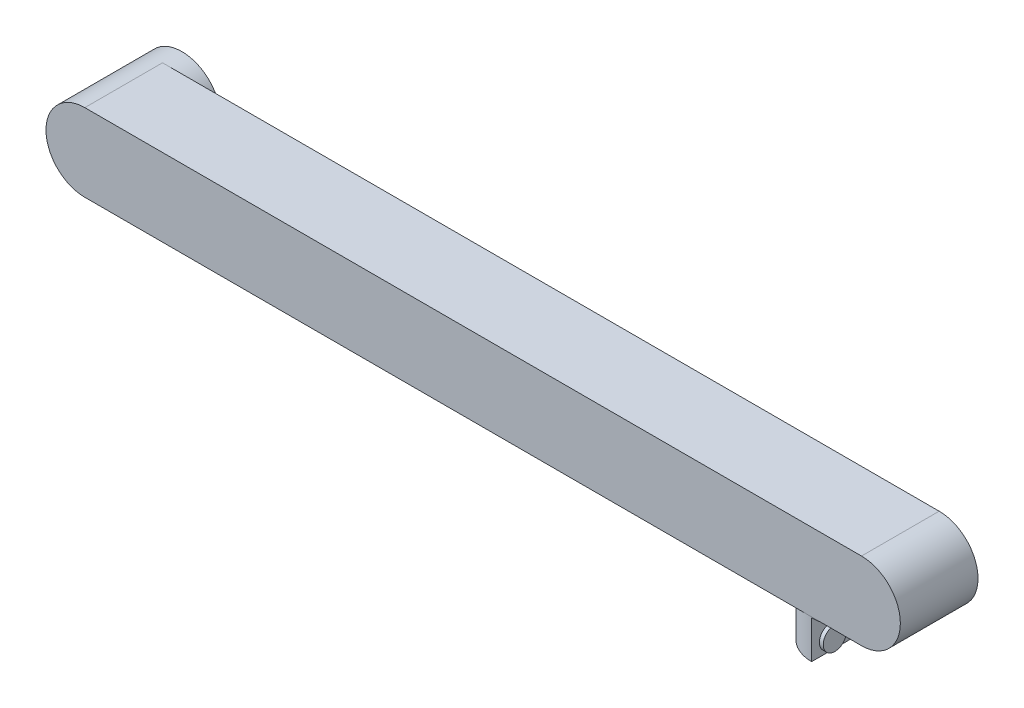
ISO-10303-21;
HEADER;
FILE_DESCRIPTION(('STEP AP214'),'2;1');
FILE_NAME('part.step','',(''),(''),'','','');
FILE_SCHEMA(('AUTOMOTIVE_DESIGN { 1 0 10303 214 1 1 1 1 }'));
ENDSEC;
DATA;
#1=APPLICATION_CONTEXT('core data for automotive mechanical design processes');
#2=APPLICATION_PROTOCOL_DEFINITION('international standard','automotive_design',2000,#1);
#3=PRODUCT_CONTEXT('',#1,'mechanical');
#4=PRODUCT('Part','Part','',(#3));
#5=PRODUCT_RELATED_PRODUCT_CATEGORY('part','',(#4));
#6=PRODUCT_DEFINITION_FORMATION('','',#4);
#7=PRODUCT_DEFINITION_CONTEXT('part definition',#1,'design');
#8=PRODUCT_DEFINITION('design','',#6,#7);
#9=PRODUCT_DEFINITION_SHAPE('','',#8);
#10=(LENGTH_UNIT() NAMED_UNIT(*) SI_UNIT(.MILLI.,.METRE.));
#11=(NAMED_UNIT(*) PLANE_ANGLE_UNIT() SI_UNIT($,.RADIAN.));
#12=(NAMED_UNIT(*) SI_UNIT($,.STERADIAN.) SOLID_ANGLE_UNIT());
#13=UNCERTAINTY_MEASURE_WITH_UNIT(LENGTH_MEASURE(1.E-05),#10,'distance_accuracy_value','');
#14=(GEOMETRIC_REPRESENTATION_CONTEXT(3) GLOBAL_UNCERTAINTY_ASSIGNED_CONTEXT((#13)) GLOBAL_UNIT_ASSIGNED_CONTEXT((#10,
#11,#12)) REPRESENTATION_CONTEXT('',''));
#15=CARTESIAN_POINT('',(0.,0.,0.));
#16=DIRECTION('',(0.,0.,1.));
#17=DIRECTION('',(1.,0.,0.));
#18=AXIS2_PLACEMENT_3D('',#15,#16,#17);
#19=CARTESIAN_POINT('',(117.087248421469,-10.7921939320018,10.));
#20=DIRECTION('',(0.,1.,0.));
#21=DIRECTION('',(0.,0.,1.));
#22=AXIS2_PLACEMENT_3D('',#19,#20,#21);
#23=CYLINDRICAL_SURFACE('',#22,10.);
#24=CARTESIAN_POINT('',(117.087248421469,-0.792193932001847,10.));
#25=DIRECTION('',(0.,-1.,0.));
#26=DIRECTION('',(0.,0.,-1.));
#27=AXIS2_PLACEMENT_3D('',#24,#25,#26);
#28=CIRCLE('',#27,10.);
#29=CARTESIAN_POINT('',(117.087248421469,-0.792193932001847,0.));
#30=VERTEX_POINT('',#29);
#31=CARTESIAN_POINT('',(117.087248421469,-0.792193932001847,20.));
#32=VERTEX_POINT('',#31);
#33=EDGE_CURVE('E67',#30,#32,#28,.T.);
#34=ORIENTED_EDGE('',*,*,#33,.T.);
#35=EDGE_CURVE('E153',#32,#30,#28,.T.);
#36=ORIENTED_EDGE('',*,*,#35,.T.);
#37=EDGE_LOOP('',(#34,#36));
#38=FACE_BOUND('',#37,.T.);
#39=DIRECTION('',(0.,1.,0.));
#40=VECTOR('',#39,1.);
#41=CARTESIAN_POINT('',(117.,-10.7921939320018,0.000380621596074437));
#42=LINE('',#41,#40);
#43=CARTESIAN_POINT('',(117.,-10.7921939320018,0.000380621596074437));
#44=VERTEX_POINT('',#43);
#45=CARTESIAN_POINT('',(117.,-0.990499508233855,0.000380621596074437));
#46=VERTEX_POINT('',#45);
#47=EDGE_CURVE('E150',#44,#46,#42,.T.);
#48=ORIENTED_EDGE('',*,*,#47,.F.);
#49=CARTESIAN_POINT('',(117.087248421469,-10.7921939320018,10.));
#50=DIRECTION('',(0.,-1.,0.));
#51=DIRECTION('',(0.,0.,-1.));
#52=AXIS2_PLACEMENT_3D('',#49,#50,#51);
#53=CIRCLE('',#52,10.);
#54=CARTESIAN_POINT('',(117.,-10.7921939320018,19.9996193784039));
#55=VERTEX_POINT('',#54);
#56=EDGE_CURVE('E154',#55,#44,#53,.T.);
#57=ORIENTED_EDGE('',*,*,#56,.F.);
#58=DIRECTION('',(0.,1.,0.));
#59=VECTOR('',#58,1.);
#60=CARTESIAN_POINT('',(117.,-10.7921939320018,19.9996193784039));
#61=LINE('',#60,#59);
#62=CARTESIAN_POINT('',(117.,-0.990499508233855,19.9996193784039));
#63=VERTEX_POINT('',#62);
#64=EDGE_CURVE('E59',#63,#55,#61,.F.);
#65=ORIENTED_EDGE('',*,*,#64,.F.);
#66=CARTESIAN_POINT('',(117.087248421469,-0.990499508233855,10.));
#67=DIRECTION('',(0.,-1.,0.));
#68=DIRECTION('',(0.,0.,-1.));
#69=AXIS2_PLACEMENT_3D('',#66,#67,#68);
#70=CIRCLE('',#69,10.);
#71=EDGE_CURVE('E11',#46,#63,#70,.T.);
#72=ORIENTED_EDGE('',*,*,#71,.F.);
#73=EDGE_LOOP('',(#48,#57,#65,#72));
#74=FACE_BOUND('',#73,.T.);
#75=ADVANCED_FACE('F43',(#38,#74),#23,.T.);
#76=CARTESIAN_POINT('',(117.087248421469,-10.7921939320018,10.));
#77=DIRECTION('',(0.,-1.,0.));
#78=DIRECTION('',(0.,0.,-1.));
#79=AXIS2_PLACEMENT_3D('',#76,#77,#78);
#80=PLANE('',#79);
#81=ORIENTED_EDGE('',*,*,#56,.T.);
#82=DIRECTION('',(0.,0.,1.));
#83=VECTOR('',#82,1.);
#84=CARTESIAN_POINT('',(117.,-10.7921939320018,10.));
#85=LINE('',#84,#83);
#86=EDGE_CURVE('E52',#44,#55,#85,.T.);
#87=ORIENTED_EDGE('',*,*,#86,.T.);
#88=EDGE_LOOP('',(#81,#87));
#89=FACE_BOUND('',#88,.T.);
#90=ADVANCED_FACE('F188',(#89),#80,.T.);
#91=CARTESIAN_POINT('',(129.860527519439,-0.792193932001847,20.));
#92=DIRECTION('',(0.,1.,0.));
#93=DIRECTION('',(0.,0.,1.));
#94=AXIS2_PLACEMENT_3D('',#91,#92,#93);
#95=PLANE('',#94);
#96=ORIENTED_EDGE('',*,*,#35,.F.);
#97=DIRECTION('',(1.,0.,0.));
#98=VECTOR('',#97,1.);
#99=CARTESIAN_POINT('',(129.860527519439,-0.792193932001847,20.));
#100=LINE('',#99,#98);
#101=CARTESIAN_POINT('',(-70.139472480561,-0.792193932001847,20.));
#102=VERTEX_POINT('',#101);
#103=EDGE_CURVE('E122',#102,#32,#100,.T.);
#104=ORIENTED_EDGE('',*,*,#103,.F.);
#105=DIRECTION('',(0.,0.,-1.));
#106=VECTOR('',#105,1.);
#107=CARTESIAN_POINT('',(-70.139472480561,-0.792193932001847,20.));
#108=LINE('',#107,#106);
#109=CARTESIAN_POINT('',(-70.139472480561,-0.792193932001842,0.));
#110=VERTEX_POINT('',#109);
#111=EDGE_CURVE('E120',#102,#110,#108,.T.);
#112=ORIENTED_EDGE('',*,*,#111,.T.);
#113=DIRECTION('',(1.,0.,0.));
#114=VECTOR('',#113,1.);
#115=CARTESIAN_POINT('',(129.860527519439,-0.792193932001847,0.));
#116=LINE('',#115,#114);
#117=EDGE_CURVE('E103',#110,#30,#116,.T.);
#118=ORIENTED_EDGE('',*,*,#117,.T.);
#119=EDGE_LOOP('',(#96,#104,#112,#118));
#120=FACE_BOUND('',#119,.T.);
#121=ADVANCED_FACE('F121',(#120),#95,.F.);
#122=CARTESIAN_POINT('',(-70.139472480561,9.20780606799817,20.));
#123=DIRECTION('',(0.,0.,-1.));
#124=DIRECTION('',(-1.,0.,0.));
#125=AXIS2_PLACEMENT_3D('',#122,#123,#124);
#126=CYLINDRICAL_SURFACE('',#125,10.);
#127=DIRECTION('',(0.,0.,-1.));
#128=VECTOR('',#127,1.);
#129=CARTESIAN_POINT('',(-70.139472480561,19.2078060679982,20.));
#130=LINE('',#129,#128);
#131=CARTESIAN_POINT('',(-70.139472480561,19.2078060679982,20.));
#132=VERTEX_POINT('',#131);
#133=CARTESIAN_POINT('',(-70.139472480561,19.2078060679982,0.));
#134=VERTEX_POINT('',#133);
#135=EDGE_CURVE('E131',#132,#134,#130,.T.);
#136=ORIENTED_EDGE('',*,*,#135,.T.);
#137=CARTESIAN_POINT('',(-70.139472480561,9.20780606799817,0.));
#138=DIRECTION('',(0.,0.,-1.));
#139=DIRECTION('',(-1.,0.,0.));
#140=AXIS2_PLACEMENT_3D('',#137,#138,#139);
#141=CIRCLE('',#140,10.);
#142=EDGE_CURVE('E108',#134,#110,#141,.T.);
#143=ORIENTED_EDGE('',*,*,#142,.T.);
#144=ORIENTED_EDGE('',*,*,#111,.F.);
#145=CARTESIAN_POINT('',(-70.139472480561,9.20780606799817,20.));
#146=DIRECTION('',(0.,0.,1.));
#147=DIRECTION('',(1.,0.,0.));
#148=AXIS2_PLACEMENT_3D('',#145,#146,#147);
#149=CIRCLE('',#148,10.);
#150=EDGE_CURVE('E160',#132,#102,#149,.T.);
#151=ORIENTED_EDGE('',*,*,#150,.F.);
#152=EDGE_LOOP('',(#136,#143,#144,#151));
#153=FACE_BOUND('',#152,.T.);
#154=CARTESIAN_POINT('',(-70.139472480561,9.20780606799817,-5.));
#155=DIRECTION('',(0.,0.,-1.));
#156=DIRECTION('',(-1.,0.,0.));
#157=AXIS2_PLACEMENT_3D('',#154,#155,#156);
#158=CIRCLE('',#157,10.);
#159=CARTESIAN_POINT('',(-80.139472480561,9.20780606799817,-5.));
#160=VERTEX_POINT('',#159);
#161=EDGE_CURVE('E133',#160,#160,#158,.T.);
#162=ORIENTED_EDGE('',*,*,#161,.F.);
#163=EDGE_LOOP('',(#162));
#164=FACE_BOUND('',#163,.T.);
#165=ADVANCED_FACE('F45',(#153,#164),#126,.T.);
#166=ORIENTED_EDGE('',*,*,#33,.F.);
#167=CARTESIAN_POINT('',(129.860527519439,-0.792193932001842,0.));
#168=VERTEX_POINT('',#167);
#169=EDGE_CURVE('E111',#30,#168,#116,.T.);
#170=ORIENTED_EDGE('',*,*,#169,.T.);
#171=DIRECTION('',(0.,0.,-1.));
#172=VECTOR('',#171,1.);
#173=CARTESIAN_POINT('',(129.860527519439,-0.792193932001842,20.));
#174=LINE('',#173,#172);
#175=CARTESIAN_POINT('',(129.860527519439,-0.792193932001842,20.));
#176=VERTEX_POINT('',#175);
#177=EDGE_CURVE('E126',#176,#168,#174,.T.);
#178=ORIENTED_EDGE('',*,*,#177,.F.);
#179=EDGE_CURVE('E163',#32,#176,#100,.T.);
#180=ORIENTED_EDGE('',*,*,#179,.F.);
#181=EDGE_LOOP('',(#166,#170,#178,#180));
#182=FACE_BOUND('',#181,.T.);
#183=ADVANCED_FACE('F224',(#182),#95,.F.);
#184=CARTESIAN_POINT('',(129.860527519439,9.20780606799817,20.));
#185=DIRECTION('',(0.,0.,-1.));
#186=DIRECTION('',(-1.,0.,0.));
#187=AXIS2_PLACEMENT_3D('',#184,#185,#186);
#188=CYLINDRICAL_SURFACE('',#187,10.);
#189=CARTESIAN_POINT('',(129.860527519439,9.20780606799817,0.));
#190=DIRECTION('',(0.,0.,1.));
#191=DIRECTION('',(-1.,0.,0.));
#192=AXIS2_PLACEMENT_3D('',#189,#190,#191);
#193=CIRCLE('',#192,10.);
#194=CARTESIAN_POINT('',(129.860527519439,19.2078060679982,0.));
#195=VERTEX_POINT('',#194);
#196=EDGE_CURVE('E116',#168,#195,#193,.T.);
#197=ORIENTED_EDGE('',*,*,#196,.T.);
#198=DIRECTION('',(0.,0.,-1.));
#199=VECTOR('',#198,1.);
#200=CARTESIAN_POINT('',(129.860527519439,19.2078060679982,20.));
#201=LINE('',#200,#199);
#202=CARTESIAN_POINT('',(129.860527519439,19.2078060679982,20.));
#203=VERTEX_POINT('',#202);
#204=EDGE_CURVE('E179',#203,#195,#201,.T.);
#205=ORIENTED_EDGE('',*,*,#204,.F.);
#206=CARTESIAN_POINT('',(129.860527519439,9.20780606799817,20.));
#207=DIRECTION('',(0.,0.,1.));
#208=DIRECTION('',(-1.,0.,0.));
#209=AXIS2_PLACEMENT_3D('',#206,#207,#208);
#210=CIRCLE('',#209,10.);
#211=EDGE_CURVE('E167',#176,#203,#210,.T.);
#212=ORIENTED_EDGE('',*,*,#211,.F.);
#213=ORIENTED_EDGE('',*,*,#177,.T.);
#214=EDGE_LOOP('',(#197,#205,#212,#213));
#215=FACE_BOUND('',#214,.T.);
#216=ADVANCED_FACE('F221',(#215),#188,.T.);
#217=CARTESIAN_POINT('',(-70.139472480561,19.2078060679982,20.));
#218=DIRECTION('',(0.,-1.,0.));
#219=DIRECTION('',(0.,0.,-1.));
#220=AXIS2_PLACEMENT_3D('',#217,#218,#219);
#221=PLANE('',#220);
#222=DIRECTION('',(-1.,0.,0.));
#223=VECTOR('',#222,1.);
#224=CARTESIAN_POINT('',(-70.139472480561,19.2078060679982,0.));
#225=LINE('',#224,#223);
#226=EDGE_CURVE('E164',#195,#134,#225,.T.);
#227=ORIENTED_EDGE('',*,*,#226,.T.);
#228=ORIENTED_EDGE('',*,*,#135,.F.);
#229=DIRECTION('',(-1.,0.,0.));
#230=VECTOR('',#229,1.);
#231=CARTESIAN_POINT('',(-70.139472480561,19.2078060679982,20.));
#232=LINE('',#231,#230);
#233=EDGE_CURVE('E170',#203,#132,#232,.T.);
#234=ORIENTED_EDGE('',*,*,#233,.F.);
#235=ORIENTED_EDGE('',*,*,#204,.T.);
#236=EDGE_LOOP('',(#227,#228,#234,#235));
#237=FACE_BOUND('',#236,.T.);
#238=ADVANCED_FACE('F216',(#237),#221,.F.);
#239=CARTESIAN_POINT('',(-70.139472480561,9.20780606799817,20.));
#240=DIRECTION('',(0.,0.,1.));
#241=DIRECTION('',(1.,0.,0.));
#242=AXIS2_PLACEMENT_3D('',#239,#240,#241);
#243=PLANE('',#242);
#244=ORIENTED_EDGE('',*,*,#150,.T.);
#245=ORIENTED_EDGE('',*,*,#103,.T.);
#246=ORIENTED_EDGE('',*,*,#179,.T.);
#247=ORIENTED_EDGE('',*,*,#211,.T.);
#248=ORIENTED_EDGE('',*,*,#233,.T.);
#249=EDGE_LOOP('',(#244,#245,#246,#247,#248));
#250=FACE_BOUND('',#249,.T.);
#251=ADVANCED_FACE('F205',(#250),#243,.T.);
#252=CARTESIAN_POINT('',(-70.139472480561,9.20780606799817,0.));
#253=DIRECTION('',(0.,0.,1.));
#254=DIRECTION('',(1.,0.,0.));
#255=AXIS2_PLACEMENT_3D('',#252,#253,#254);
#256=PLANE('',#255);
#257=ORIENTED_EDGE('',*,*,#142,.F.);
#258=ORIENTED_EDGE('',*,*,#226,.F.);
#259=ORIENTED_EDGE('',*,*,#196,.F.);
#260=ORIENTED_EDGE('',*,*,#169,.F.);
#261=ORIENTED_EDGE('',*,*,#117,.F.);
#262=EDGE_LOOP('',(#257,#258,#259,#260,#261));
#263=FACE_BOUND('',#262,.T.);
#264=ADVANCED_FACE('F105',(#263),#256,.F.);
#265=CARTESIAN_POINT('',(167.,-0.990499508233855,22.2652380055544));
#266=DIRECTION('',(0.,-1.,0.));
#267=DIRECTION('',(0.,0.,-1.));
#268=AXIS2_PLACEMENT_3D('',#265,#266,#267);
#269=PLANE('',#268);
#270=ORIENTED_EDGE('',*,*,#71,.T.);
#271=DIRECTION('',(0.,0.,1.));
#272=VECTOR('',#271,1.);
#273=CARTESIAN_POINT('',(117.,-0.990499508233855,22.2652380055544));
#274=LINE('',#273,#272);
#275=EDGE_CURVE('E139',#46,#63,#274,.T.);
#276=ORIENTED_EDGE('',*,*,#275,.F.);
#277=EDGE_LOOP('',(#270,#276));
#278=FACE_BOUND('',#277,.T.);
#279=ADVANCED_FACE('F195',(#278),#269,.T.);
#280=CARTESIAN_POINT('',(117.,0.,0.));
#281=DIRECTION('',(1.,0.,0.));
#282=DIRECTION('',(0.,0.,-1.));
#283=AXIS2_PLACEMENT_3D('',#280,#281,#282);
#284=PLANE('',#283);
#285=CARTESIAN_POINT('',(117.,-7.51468869297927,5.));
#286=DIRECTION('',(1.,0.,0.));
#287=DIRECTION('',(0.,0.,-1.));
#288=AXIS2_PLACEMENT_3D('',#285,#286,#287);
#289=CIRCLE('',#288,3.);
#290=CARTESIAN_POINT('',(117.,-7.51468869297927,2.));
#291=VERTEX_POINT('',#290);
#292=EDGE_CURVE('E385',#291,#291,#289,.T.);
#293=ORIENTED_EDGE('',*,*,#292,.F.);
#294=EDGE_LOOP('',(#293));
#295=FACE_BOUND('',#294,.T.);
#296=CARTESIAN_POINT('',(117.,-7.51468869297927,14.9922946766754));
#297=DIRECTION('',(1.,0.,0.));
#298=DIRECTION('',(0.,0.,-1.));
#299=AXIS2_PLACEMENT_3D('',#296,#297,#298);
#300=CIRCLE('',#299,3.);
#301=CARTESIAN_POINT('',(117.,-7.51468869297927,11.9922946766754));
#302=VERTEX_POINT('',#301);
#303=EDGE_CURVE('E142',#302,#302,#300,.T.);
#304=ORIENTED_EDGE('',*,*,#303,.F.);
#305=EDGE_LOOP('',(#304));
#306=FACE_BOUND('',#305,.T.);
#307=ORIENTED_EDGE('',*,*,#47,.T.);
#308=ORIENTED_EDGE('',*,*,#275,.T.);
#309=ORIENTED_EDGE('',*,*,#64,.T.);
#310=ORIENTED_EDGE('',*,*,#86,.F.);
#311=EDGE_LOOP('',(#307,#308,#309,#310));
#312=FACE_BOUND('',#311,.T.);
#313=ADVANCED_FACE('F193',(#295,#306,#312),#284,.T.);
#314=CARTESIAN_POINT('',(-70.139472480561,9.20780606799817,-5.));
#315=DIRECTION('',(0.,0.,-1.));
#316=DIRECTION('',(-1.,0.,0.));
#317=AXIS2_PLACEMENT_3D('',#314,#315,#316);
#318=PLANE('',#317);
#319=ORIENTED_EDGE('',*,*,#161,.T.);
#320=EDGE_LOOP('',(#319));
#321=FACE_BOUND('',#320,.T.);
#322=ADVANCED_FACE('F202',(#321),#318,.T.);
#323=CARTESIAN_POINT('',(118.,-7.51468869297927,14.9922946766754));
#324=DIRECTION('',(-1.,0.,0.));
#325=DIRECTION('',(0.,0.,1.));
#326=AXIS2_PLACEMENT_3D('',#323,#324,#325);
#327=CYLINDRICAL_SURFACE('',#326,3.);
#328=CARTESIAN_POINT('',(118.,-7.51468869297927,14.9922946766754));
#329=DIRECTION('',(1.,0.,0.));
#330=DIRECTION('',(0.,0.,-1.));
#331=AXIS2_PLACEMENT_3D('',#328,#329,#330);
#332=CIRCLE('',#331,3.);
#333=CARTESIAN_POINT('',(118.,-7.51468869297927,11.9922946766754));
#334=VERTEX_POINT('',#333);
#335=EDGE_CURVE('E134',#334,#334,#332,.T.);
#336=ORIENTED_EDGE('',*,*,#335,.F.);
#337=EDGE_LOOP('',(#336));
#338=FACE_BOUND('',#337,.T.);
#339=ORIENTED_EDGE('',*,*,#303,.T.);
#340=EDGE_LOOP('',(#339));
#341=FACE_BOUND('',#340,.T.);
#342=ADVANCED_FACE('F270',(#338,#341),#327,.T.);
#343=CARTESIAN_POINT('',(118.,-7.51468869297927,14.9922946766754));
#344=DIRECTION('',(1.,0.,0.));
#345=DIRECTION('',(0.,0.,-1.));
#346=AXIS2_PLACEMENT_3D('',#343,#344,#345);
#347=PLANE('',#346);
#348=ORIENTED_EDGE('',*,*,#335,.T.);
#349=EDGE_LOOP('',(#348));
#350=FACE_BOUND('',#349,.T.);
#351=ADVANCED_FACE('F287',(#350),#347,.T.);
#352=CARTESIAN_POINT('',(118.,-7.51468869297927,5.));
#353=DIRECTION('',(-1.,0.,0.));
#354=DIRECTION('',(0.,0.,1.));
#355=AXIS2_PLACEMENT_3D('',#352,#353,#354);
#356=CYLINDRICAL_SURFACE('',#355,3.);
#357=CARTESIAN_POINT('',(118.,-7.51468869297927,5.));
#358=DIRECTION('',(1.,0.,0.));
#359=DIRECTION('',(0.,0.,-1.));
#360=AXIS2_PLACEMENT_3D('',#357,#358,#359);
#361=CIRCLE('',#360,3.);
#362=CARTESIAN_POINT('',(118.,-7.51468869297927,2.));
#363=VERTEX_POINT('',#362);
#364=EDGE_CURVE('E383',#363,#363,#361,.T.);
#365=ORIENTED_EDGE('',*,*,#364,.F.);
#366=EDGE_LOOP('',(#365));
#367=FACE_BOUND('',#366,.T.);
#368=ORIENTED_EDGE('',*,*,#292,.T.);
#369=EDGE_LOOP('',(#368));
#370=FACE_BOUND('',#369,.T.);
#371=ADVANCED_FACE('F298',(#367,#370),#356,.T.);
#372=CARTESIAN_POINT('',(118.,-7.51468869297927,5.));
#373=DIRECTION('',(1.,0.,0.));
#374=DIRECTION('',(0.,0.,-1.));
#375=AXIS2_PLACEMENT_3D('',#372,#373,#374);
#376=PLANE('',#375);
#377=ORIENTED_EDGE('',*,*,#364,.T.);
#378=EDGE_LOOP('',(#377));
#379=FACE_BOUND('',#378,.T.);
#380=ADVANCED_FACE('F309',(#379),#376,.T.);
#381=CLOSED_SHELL('',(#75,#90,#121,#165,#183,#216,#238,#251,#264,#279,#313,#322,#342,#351,#371,#380));
#382=MANIFOLD_SOLID_BREP('B2',#381);
#383=ADVANCED_BREP_SHAPE_REPRESENTATION('',(#18,#382),#14);
#384=SHAPE_DEFINITION_REPRESENTATION(#9,#383);
ENDSEC;
END-ISO-10303-21;
